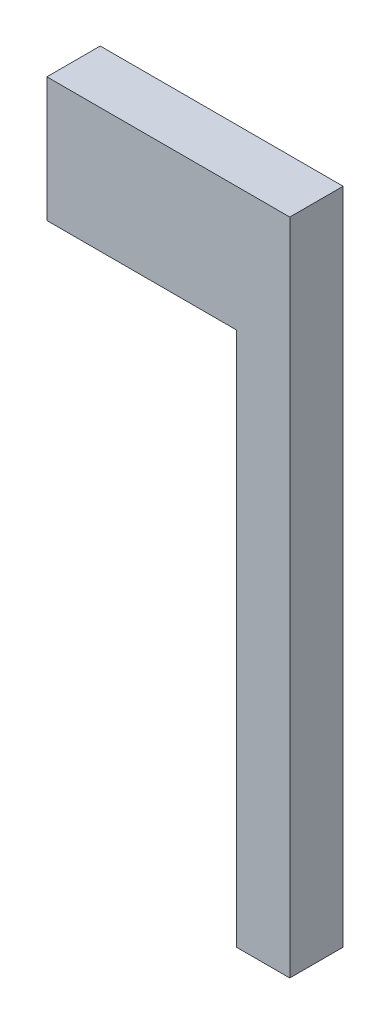
ISO-10303-21;
HEADER;
FILE_DESCRIPTION(('STEP AP214'),'2;1');
FILE_NAME('part.step','',(''),(''),'','','');
FILE_SCHEMA(('AUTOMOTIVE_DESIGN { 1 0 10303 214 1 1 1 1 }'));
ENDSEC;
DATA;
#1=APPLICATION_CONTEXT('core data for automotive mechanical design processes');
#2=APPLICATION_PROTOCOL_DEFINITION('international standard','automotive_design',2000,#1);
#3=PRODUCT_CONTEXT('',#1,'mechanical');
#4=PRODUCT('Part','Part','',(#3));
#5=PRODUCT_RELATED_PRODUCT_CATEGORY('part','',(#4));
#6=PRODUCT_DEFINITION_FORMATION('','',#4);
#7=PRODUCT_DEFINITION_CONTEXT('part definition',#1,'design');
#8=PRODUCT_DEFINITION('design','',#6,#7);
#9=PRODUCT_DEFINITION_SHAPE('','',#8);
#10=(LENGTH_UNIT() NAMED_UNIT(*) SI_UNIT(.MILLI.,.METRE.));
#11=(NAMED_UNIT(*) PLANE_ANGLE_UNIT() SI_UNIT($,.RADIAN.));
#12=(NAMED_UNIT(*) SI_UNIT($,.STERADIAN.) SOLID_ANGLE_UNIT());
#13=UNCERTAINTY_MEASURE_WITH_UNIT(LENGTH_MEASURE(1.E-05),#10,'distance_accuracy_value','');
#14=(GEOMETRIC_REPRESENTATION_CONTEXT(3) GLOBAL_UNCERTAINTY_ASSIGNED_CONTEXT((#13)) GLOBAL_UNIT_ASSIGNED_CONTEXT((#10,
#11,#12)) REPRESENTATION_CONTEXT('',''));
#15=CARTESIAN_POINT('',(0.,0.,0.));
#16=DIRECTION('',(0.,0.,1.));
#17=DIRECTION('',(1.,0.,0.));
#18=AXIS2_PLACEMENT_3D('',#15,#16,#17);
#19=CARTESIAN_POINT('',(-10.5766666666667,-11.9241702409788,3.));
#20=DIRECTION('',(0.,-1.,0.));
#21=DIRECTION('',(1.,0.,0.));
#22=AXIS2_PLACEMENT_3D('',#19,#20,#21);
#23=PLANE('',#22);
#24=DIRECTION('',(-1.,0.,0.));
#25=VECTOR('',#24,1.);
#26=CARTESIAN_POINT('',(-10.5766666666667,-11.9241702409788,0.));
#27=LINE('',#26,#25);
#28=CARTESIAN_POINT('',(3.08333333333333,-11.9241702409788,0.));
#29=VERTEX_POINT('',#28);
#30=CARTESIAN_POINT('',(-10.5766666666667,-11.9241702409788,0.));
#31=VERTEX_POINT('',#30);
#32=EDGE_CURVE('E128',#29,#31,#27,.T.);
#33=ORIENTED_EDGE('',*,*,#32,.T.);
#34=DIRECTION('',(0.,0.,-1.));
#35=VECTOR('',#34,1.);
#36=CARTESIAN_POINT('',(-10.5766666666667,-11.9241702409788,3.));
#37=LINE('',#36,#35);
#38=CARTESIAN_POINT('',(-10.5766666666667,-11.9241702409788,3.));
#39=VERTEX_POINT('',#38);
#40=EDGE_CURVE('E11',#39,#31,#37,.T.);
#41=ORIENTED_EDGE('',*,*,#40,.F.);
#42=DIRECTION('',(-1.,0.,0.));
#43=VECTOR('',#42,1.);
#44=CARTESIAN_POINT('',(-10.5766666666667,-11.9241702409788,3.));
#45=LINE('',#44,#43);
#46=CARTESIAN_POINT('',(3.08333333333333,-11.9241702409788,3.));
#47=VERTEX_POINT('',#46);
#48=EDGE_CURVE('E144',#47,#39,#45,.T.);
#49=ORIENTED_EDGE('',*,*,#48,.F.);
#50=DIRECTION('',(0.,0.,-1.));
#51=VECTOR('',#50,1.);
#52=CARTESIAN_POINT('',(3.08333333333333,-11.9241702409788,3.));
#53=LINE('',#52,#51);
#54=EDGE_CURVE('E124',#47,#29,#53,.T.);
#55=ORIENTED_EDGE('',*,*,#54,.T.);
#56=EDGE_LOOP('',(#33,#41,#49,#55));
#57=FACE_BOUND('',#56,.T.);
#58=ADVANCED_FACE('F39',(#57),#23,.F.);
#59=CARTESIAN_POINT('',(-10.5766666666667,-18.9241702409788,3.));
#60=DIRECTION('',(1.,0.,0.));
#61=DIRECTION('',(0.,0.,-1.));
#62=AXIS2_PLACEMENT_3D('',#59,#60,#61);
#63=PLANE('',#62);
#64=DIRECTION('',(0.,-1.,0.));
#65=VECTOR('',#64,1.);
#66=CARTESIAN_POINT('',(-10.5766666666667,-18.9241702409788,0.));
#67=LINE('',#66,#65);
#68=CARTESIAN_POINT('',(-10.5766666666667,-18.9241702409788,0.));
#69=VERTEX_POINT('',#68);
#70=EDGE_CURVE('E132',#31,#69,#67,.T.);
#71=ORIENTED_EDGE('',*,*,#70,.T.);
#72=DIRECTION('',(0.,0.,-1.));
#73=VECTOR('',#72,1.);
#74=CARTESIAN_POINT('',(-10.5766666666667,-18.9241702409788,3.));
#75=LINE('',#74,#73);
#76=CARTESIAN_POINT('',(-10.5766666666667,-18.9241702409788,3.));
#77=VERTEX_POINT('',#76);
#78=EDGE_CURVE('E48',#77,#69,#75,.T.);
#79=ORIENTED_EDGE('',*,*,#78,.F.);
#80=DIRECTION('',(0.,-1.,0.));
#81=VECTOR('',#80,1.);
#82=CARTESIAN_POINT('',(-10.5766666666667,-18.9241702409788,3.));
#83=LINE('',#82,#81);
#84=EDGE_CURVE('E93',#39,#77,#83,.T.);
#85=ORIENTED_EDGE('',*,*,#84,.F.);
#86=ORIENTED_EDGE('',*,*,#40,.T.);
#87=EDGE_LOOP('',(#71,#79,#85,#86));
#88=FACE_BOUND('',#87,.T.);
#89=ADVANCED_FACE('F172',(#88),#63,.F.);
#90=CARTESIAN_POINT('',(-10.5766666666667,-18.9241702409788,3.));
#91=DIRECTION('',(0.,1.,0.));
#92=DIRECTION('',(0.,0.,1.));
#93=AXIS2_PLACEMENT_3D('',#90,#91,#92);
#94=PLANE('',#93);
#95=DIRECTION('',(1.,0.,0.));
#96=VECTOR('',#95,1.);
#97=CARTESIAN_POINT('',(-10.5766666666667,-18.9241702409788,0.));
#98=LINE('',#97,#96);
#99=CARTESIAN_POINT('',(0.0833333333333315,-18.9241702409788,0.));
#100=VERTEX_POINT('',#99);
#101=EDGE_CURVE('E135',#69,#100,#98,.T.);
#102=ORIENTED_EDGE('',*,*,#101,.T.);
#103=DIRECTION('',(0.,0.,-1.));
#104=VECTOR('',#103,1.);
#105=CARTESIAN_POINT('',(0.0833333333333315,-18.9241702409788,3.));
#106=LINE('',#105,#104);
#107=CARTESIAN_POINT('',(0.0833333333333315,-18.9241702409788,3.));
#108=VERTEX_POINT('',#107);
#109=EDGE_CURVE('E117',#108,#100,#106,.T.);
#110=ORIENTED_EDGE('',*,*,#109,.F.);
#111=DIRECTION('',(1.,0.,0.));
#112=VECTOR('',#111,1.);
#113=CARTESIAN_POINT('',(-10.5766666666667,-18.9241702409788,3.));
#114=LINE('',#113,#112);
#115=EDGE_CURVE('E106',#77,#108,#114,.T.);
#116=ORIENTED_EDGE('',*,*,#115,.F.);
#117=ORIENTED_EDGE('',*,*,#78,.T.);
#118=EDGE_LOOP('',(#102,#110,#116,#117));
#119=FACE_BOUND('',#118,.T.);
#120=ADVANCED_FACE('F154',(#119),#94,.F.);
#121=CARTESIAN_POINT('',(0.0833333333333315,-18.9241702409788,3.));
#122=DIRECTION('',(1.,0.,0.));
#123=DIRECTION('',(0.,1.,0.));
#124=AXIS2_PLACEMENT_3D('',#121,#122,#123);
#125=PLANE('',#124);
#126=DIRECTION('',(0.,-1.,0.));
#127=VECTOR('',#126,1.);
#128=CARTESIAN_POINT('',(0.0833333333333315,-18.9241702409788,0.));
#129=LINE('',#128,#127);
#130=CARTESIAN_POINT('',(0.0833333333333356,-48.9841702409788,0.));
#131=VERTEX_POINT('',#130);
#132=EDGE_CURVE('E115',#100,#131,#129,.T.);
#133=ORIENTED_EDGE('',*,*,#132,.T.);
#134=DIRECTION('',(0.,0.,-1.));
#135=VECTOR('',#134,1.);
#136=CARTESIAN_POINT('',(0.0833333333333356,-48.9841702409788,3.));
#137=LINE('',#136,#135);
#138=CARTESIAN_POINT('',(0.0833333333333356,-48.9841702409788,3.));
#139=VERTEX_POINT('',#138);
#140=EDGE_CURVE('E112',#139,#131,#137,.T.);
#141=ORIENTED_EDGE('',*,*,#140,.F.);
#142=DIRECTION('',(0.,-1.,0.));
#143=VECTOR('',#142,1.);
#144=CARTESIAN_POINT('',(0.0833333333333315,-18.9241702409788,3.));
#145=LINE('',#144,#143);
#146=EDGE_CURVE('E100',#108,#139,#145,.T.);
#147=ORIENTED_EDGE('',*,*,#146,.F.);
#148=ORIENTED_EDGE('',*,*,#109,.T.);
#149=EDGE_LOOP('',(#133,#141,#147,#148));
#150=FACE_BOUND('',#149,.T.);
#151=ADVANCED_FACE('F113',(#150),#125,.F.);
#152=CARTESIAN_POINT('',(0.0833333333333356,-48.9841702409788,3.));
#153=DIRECTION('',(0.,1.,0.));
#154=DIRECTION('',(0.,0.,1.));
#155=AXIS2_PLACEMENT_3D('',#152,#153,#154);
#156=PLANE('',#155);
#157=DIRECTION('',(1.,0.,0.));
#158=VECTOR('',#157,1.);
#159=CARTESIAN_POINT('',(0.0833333333333356,-48.9841702409788,0.));
#160=LINE('',#159,#158);
#161=CARTESIAN_POINT('',(3.08333333333333,-48.9841702409788,0.));
#162=VERTEX_POINT('',#161);
#163=EDGE_CURVE('E79',#131,#162,#160,.T.);
#164=ORIENTED_EDGE('',*,*,#163,.T.);
#165=DIRECTION('',(0.,0.,-1.));
#166=VECTOR('',#165,1.);
#167=CARTESIAN_POINT('',(3.08333333333333,-48.9841702409788,3.));
#168=LINE('',#167,#166);
#169=CARTESIAN_POINT('',(3.08333333333333,-48.9841702409788,3.));
#170=VERTEX_POINT('',#169);
#171=EDGE_CURVE('E118',#170,#162,#168,.T.);
#172=ORIENTED_EDGE('',*,*,#171,.F.);
#173=DIRECTION('',(1.,0.,0.));
#174=VECTOR('',#173,1.);
#175=CARTESIAN_POINT('',(0.0833333333333356,-48.9841702409788,3.));
#176=LINE('',#175,#174);
#177=EDGE_CURVE('E104',#139,#170,#176,.T.);
#178=ORIENTED_EDGE('',*,*,#177,.F.);
#179=ORIENTED_EDGE('',*,*,#140,.T.);
#180=EDGE_LOOP('',(#164,#172,#178,#179));
#181=FACE_BOUND('',#180,.T.);
#182=ADVANCED_FACE('F120',(#181),#156,.F.);
#183=CARTESIAN_POINT('',(3.08333333333333,-48.9841702409788,3.));
#184=DIRECTION('',(-1.,0.,0.));
#185=DIRECTION('',(0.,0.,1.));
#186=AXIS2_PLACEMENT_3D('',#183,#184,#185);
#187=PLANE('',#186);
#188=DIRECTION('',(0.,1.,0.));
#189=VECTOR('',#188,1.);
#190=CARTESIAN_POINT('',(3.08333333333333,-48.9841702409788,0.));
#191=LINE('',#190,#189);
#192=EDGE_CURVE('E85',#162,#29,#191,.T.);
#193=ORIENTED_EDGE('',*,*,#192,.T.);
#194=ORIENTED_EDGE('',*,*,#54,.F.);
#195=DIRECTION('',(0.,1.,0.));
#196=VECTOR('',#195,1.);
#197=CARTESIAN_POINT('',(3.08333333333333,-48.9841702409788,3.));
#198=LINE('',#197,#196);
#199=EDGE_CURVE('E56',#170,#47,#198,.T.);
#200=ORIENTED_EDGE('',*,*,#199,.F.);
#201=ORIENTED_EDGE('',*,*,#171,.T.);
#202=EDGE_LOOP('',(#193,#194,#200,#201));
#203=FACE_BOUND('',#202,.T.);
#204=ADVANCED_FACE('F161',(#203),#187,.F.);
#205=CARTESIAN_POINT('',(0.,0.,3.));
#206=DIRECTION('',(0.,0.,1.));
#207=DIRECTION('',(1.,0.,0.));
#208=AXIS2_PLACEMENT_3D('',#205,#206,#207);
#209=PLANE('',#208);
#210=ORIENTED_EDGE('',*,*,#48,.T.);
#211=ORIENTED_EDGE('',*,*,#84,.T.);
#212=ORIENTED_EDGE('',*,*,#115,.T.);
#213=ORIENTED_EDGE('',*,*,#146,.T.);
#214=ORIENTED_EDGE('',*,*,#177,.T.);
#215=ORIENTED_EDGE('',*,*,#199,.T.);
#216=EDGE_LOOP('',(#210,#211,#212,#213,#214,#215));
#217=FACE_BOUND('',#216,.T.);
#218=ADVANCED_FACE('F102',(#217),#209,.T.);
#219=CARTESIAN_POINT('',(0.,0.,0.));
#220=DIRECTION('',(0.,0.,1.));
#221=DIRECTION('',(1.,0.,0.));
#222=AXIS2_PLACEMENT_3D('',#219,#220,#221);
#223=PLANE('',#222);
#224=ORIENTED_EDGE('',*,*,#32,.F.);
#225=ORIENTED_EDGE('',*,*,#192,.F.);
#226=ORIENTED_EDGE('',*,*,#163,.F.);
#227=ORIENTED_EDGE('',*,*,#132,.F.);
#228=ORIENTED_EDGE('',*,*,#101,.F.);
#229=ORIENTED_EDGE('',*,*,#70,.F.);
#230=EDGE_LOOP('',(#224,#225,#226,#227,#228,#229));
#231=FACE_BOUND('',#230,.T.);
#232=ADVANCED_FACE('F157',(#231),#223,.F.);
#233=CLOSED_SHELL('',(#58,#89,#120,#151,#182,#204,#218,#232));
#234=MANIFOLD_SOLID_BREP('B2',#233);
#235=ADVANCED_BREP_SHAPE_REPRESENTATION('',(#18,#234),#14);
#236=SHAPE_DEFINITION_REPRESENTATION(#9,#235);
ENDSEC;
END-ISO-10303-21;
